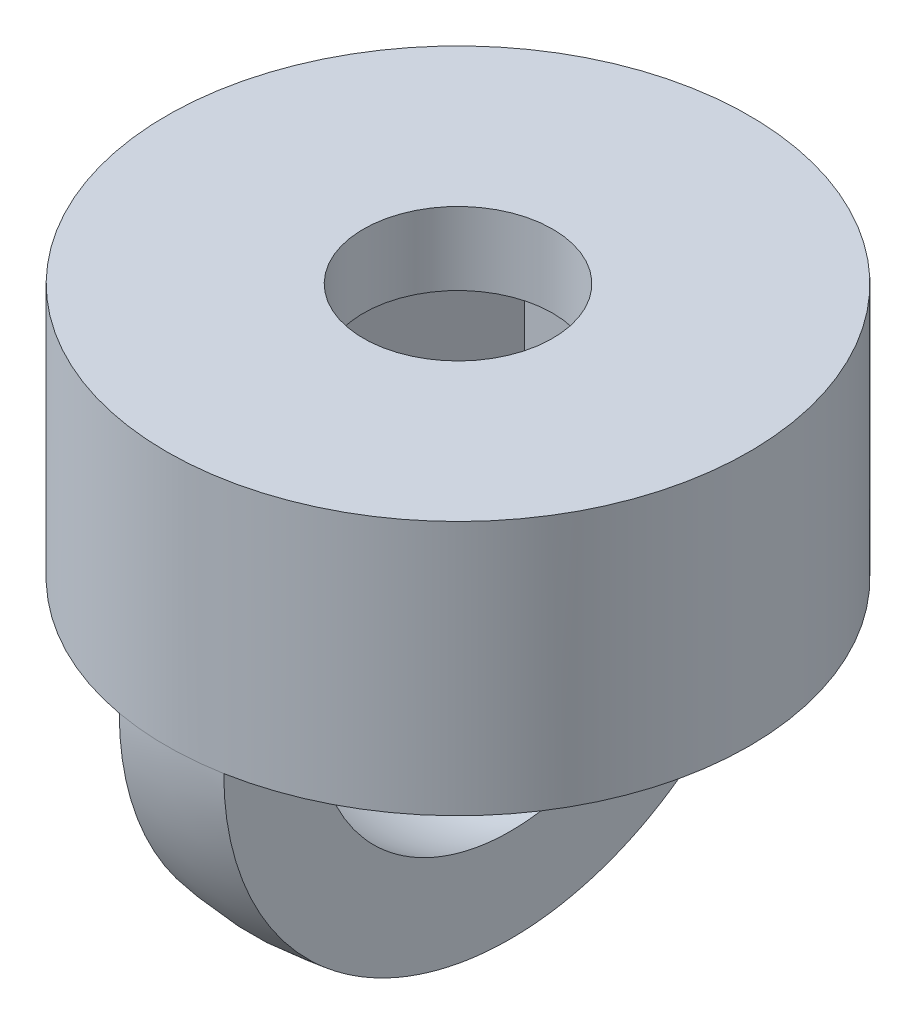
ISO-10303-21;
HEADER;
FILE_DESCRIPTION(('STEP AP214'),'2;1');
FILE_NAME('part.step','',(''),(''),'','','');
FILE_SCHEMA(('AUTOMOTIVE_DESIGN { 1 0 10303 214 1 1 1 1 }'));
ENDSEC;
DATA;
#1=APPLICATION_CONTEXT('core data for automotive mechanical design processes');
#2=APPLICATION_PROTOCOL_DEFINITION('international standard','automotive_design',2000,#1);
#3=PRODUCT_CONTEXT('',#1,'mechanical');
#4=PRODUCT('Part','Part','',(#3));
#5=PRODUCT_RELATED_PRODUCT_CATEGORY('part','',(#4));
#6=PRODUCT_DEFINITION_FORMATION('','',#4);
#7=PRODUCT_DEFINITION_CONTEXT('part definition',#1,'design');
#8=PRODUCT_DEFINITION('design','',#6,#7);
#9=PRODUCT_DEFINITION_SHAPE('','',#8);
#10=(LENGTH_UNIT() NAMED_UNIT(*) SI_UNIT(.MILLI.,.METRE.));
#11=(NAMED_UNIT(*) PLANE_ANGLE_UNIT() SI_UNIT($,.RADIAN.));
#12=(NAMED_UNIT(*) SI_UNIT($,.STERADIAN.) SOLID_ANGLE_UNIT());
#13=UNCERTAINTY_MEASURE_WITH_UNIT(LENGTH_MEASURE(1.E-05),#10,'distance_accuracy_value','');
#14=(GEOMETRIC_REPRESENTATION_CONTEXT(3) GLOBAL_UNCERTAINTY_ASSIGNED_CONTEXT((#13)) GLOBAL_UNIT_ASSIGNED_CONTEXT((#10,
#11,#12)) REPRESENTATION_CONTEXT('',''));
#15=CARTESIAN_POINT('',(0.,0.,0.));
#16=DIRECTION('',(0.,0.,1.));
#17=DIRECTION('',(1.,0.,0.));
#18=AXIS2_PLACEMENT_3D('',#15,#16,#17);
#19=CARTESIAN_POINT('',(0.,0.,0.));
#20=DIRECTION('',(0.,1.,0.));
#21=DIRECTION('',(-1.,0.,0.));
#22=AXIS2_PLACEMENT_3D('',#19,#20,#21);
#23=SPHERICAL_SURFACE('',#22,5.5);
#24=CARTESIAN_POINT('',(-1.43520407206952,0.,0.));
#25=DIRECTION('',(-1.,0.,0.));
#26=DIRECTION('',(0.,0.,1.));
#27=AXIS2_PLACEMENT_3D('',#24,#25,#26);
#28=CIRCLE('',#27,5.30944340505811);
#29=CARTESIAN_POINT('',(-1.43520407206952,0.,5.30944340505811));
#30=VERTEX_POINT('',#29);
#31=CARTESIAN_POINT('',(-1.43520407206952,0.,-5.30944340505811));
#32=VERTEX_POINT('',#31);
#33=EDGE_CURVE('E137',#30,#32,#28,.F.);
#34=ORIENTED_EDGE('',*,*,#33,.F.);
#35=CARTESIAN_POINT('',(0.,0.,0.));
#36=DIRECTION('',(0.,1.,0.));
#37=DIRECTION('',(0.,0.,1.));
#38=AXIS2_PLACEMENT_3D('',#35,#36,#37);
#39=CIRCLE('',#38,5.5);
#40=CARTESIAN_POINT('',(1.43520407206952,0.,5.30944340505811));
#41=VERTEX_POINT('',#40);
#42=EDGE_CURVE('E135',#30,#41,#39,.T.);
#43=ORIENTED_EDGE('',*,*,#42,.T.);
#44=CARTESIAN_POINT('',(1.43520407206952,0.,0.));
#45=DIRECTION('',(-1.,0.,0.));
#46=DIRECTION('',(0.,0.,1.));
#47=AXIS2_PLACEMENT_3D('',#44,#45,#46);
#48=CIRCLE('',#47,5.30944340505811);
#49=CARTESIAN_POINT('',(1.43520407206952,0.,-5.30944340505811));
#50=VERTEX_POINT('',#49);
#51=EDGE_CURVE('E124',#41,#50,#48,.F.);
#52=ORIENTED_EDGE('',*,*,#51,.T.);
#53=EDGE_CURVE('E134',#50,#32,#39,.T.);
#54=ORIENTED_EDGE('',*,*,#53,.T.);
#55=EDGE_LOOP('',(#34,#43,#52,#54));
#56=FACE_BOUND('',#55,.T.);
#57=ADVANCED_FACE('F43',(#56),#23,.F.);
#58=CARTESIAN_POINT('',(0.,0.,0.));
#59=DIRECTION('',(0.,1.,0.));
#60=DIRECTION('',(-1.,0.,0.));
#61=AXIS2_PLACEMENT_3D('',#58,#59,#60);
#62=SPHERICAL_SURFACE('',#61,8.);
#63=CARTESIAN_POINT('',(0.,0.,0.));
#64=DIRECTION('',(0.,1.,0.));
#65=DIRECTION('',(0.,0.,1.));
#66=AXIS2_PLACEMENT_3D('',#63,#64,#65);
#67=CIRCLE('',#66,8.);
#68=CARTESIAN_POINT('',(-1.43520407206952,0.,7.87020897254419));
#69=VERTEX_POINT('',#68);
#70=CARTESIAN_POINT('',(1.43520407206952,0.,7.87020897254419));
#71=VERTEX_POINT('',#70);
#72=EDGE_CURVE('E225',#69,#71,#67,.T.);
#73=ORIENTED_EDGE('',*,*,#72,.F.);
#74=CARTESIAN_POINT('',(-1.43520407206952,0.,0.));
#75=DIRECTION('',(-1.,0.,0.));
#76=DIRECTION('',(0.,0.,1.));
#77=AXIS2_PLACEMENT_3D('',#74,#75,#76);
#78=CIRCLE('',#77,7.87020897254419);
#79=CARTESIAN_POINT('',(-1.43520407206952,0.,-7.87020897254419));
#80=VERTEX_POINT('',#79);
#81=EDGE_CURVE('E11',#69,#80,#78,.F.);
#82=ORIENTED_EDGE('',*,*,#81,.T.);
#83=CARTESIAN_POINT('',(1.43520407206952,0.,-7.87020897254419));
#84=VERTEX_POINT('',#83);
#85=EDGE_CURVE('E224',#84,#80,#67,.T.);
#86=ORIENTED_EDGE('',*,*,#85,.F.);
#87=CARTESIAN_POINT('',(1.43520407206952,0.,0.));
#88=DIRECTION('',(-1.,0.,0.));
#89=DIRECTION('',(0.,0.,1.));
#90=AXIS2_PLACEMENT_3D('',#87,#88,#89);
#91=CIRCLE('',#90,7.87020897254419);
#92=EDGE_CURVE('E52',#71,#84,#91,.F.);
#93=ORIENTED_EDGE('',*,*,#92,.F.);
#94=EDGE_LOOP('',(#73,#82,#86,#93));
#95=FACE_BOUND('',#94,.T.);
#96=ADVANCED_FACE('F244',(#95),#62,.T.);
#97=CARTESIAN_POINT('',(0.,0.,0.));
#98=DIRECTION('',(0.,1.,0.));
#99=DIRECTION('',(0.,0.,1.));
#100=AXIS2_PLACEMENT_3D('',#97,#98,#99);
#101=PLANE('',#100);
#102=DIRECTION('',(0.5,0.,0.866025403784439));
#103=VECTOR('',#102,1.);
#104=CARTESIAN_POINT('',(3.75,0.,-2.1650635094611));
#105=LINE('',#104,#103);
#106=CARTESIAN_POINT('',(2.5,0.,-4.33012701892219));
#107=VERTEX_POINT('',#106);
#108=CARTESIAN_POINT('',(5.,0.,0.));
#109=VERTEX_POINT('',#108);
#110=EDGE_CURVE('E183',#107,#109,#105,.T.);
#111=ORIENTED_EDGE('',*,*,#110,.F.);
#112=DIRECTION('',(1.,0.,0.));
#113=VECTOR('',#112,1.);
#114=CARTESIAN_POINT('',(0.,0.,-4.33012701892219));
#115=LINE('',#114,#113);
#116=CARTESIAN_POINT('',(-2.5,0.,-4.33012701892219));
#117=VERTEX_POINT('',#116);
#118=EDGE_CURVE('E186',#117,#107,#115,.T.);
#119=ORIENTED_EDGE('',*,*,#118,.F.);
#120=DIRECTION('',(-0.5,0.,0.866025403784439));
#121=VECTOR('',#120,1.);
#122=CARTESIAN_POINT('',(-3.75,0.,-2.1650635094611));
#123=LINE('',#122,#121);
#124=CARTESIAN_POINT('',(-5.,0.,0.));
#125=VERTEX_POINT('',#124);
#126=EDGE_CURVE('E167',#117,#125,#123,.T.);
#127=ORIENTED_EDGE('',*,*,#126,.T.);
#128=DIRECTION('',(0.5,0.,0.866025403784439));
#129=VECTOR('',#128,1.);
#130=CARTESIAN_POINT('',(-3.75,0.,2.1650635094611));
#131=LINE('',#130,#129);
#132=CARTESIAN_POINT('',(-2.5,0.,4.33012701892219));
#133=VERTEX_POINT('',#132);
#134=EDGE_CURVE('E172',#125,#133,#131,.T.);
#135=ORIENTED_EDGE('',*,*,#134,.T.);
#136=DIRECTION('',(1.,0.,0.));
#137=VECTOR('',#136,1.);
#138=CARTESIAN_POINT('',(0.,0.,4.33012701892219));
#139=LINE('',#138,#137);
#140=CARTESIAN_POINT('',(2.5,0.,4.33012701892219));
#141=VERTEX_POINT('',#140);
#142=EDGE_CURVE('E176',#133,#141,#139,.T.);
#143=ORIENTED_EDGE('',*,*,#142,.T.);
#144=DIRECTION('',(-0.5,0.,0.866025403784439));
#145=VECTOR('',#144,1.);
#146=CARTESIAN_POINT('',(3.75,0.,2.1650635094611));
#147=LINE('',#146,#145);
#148=EDGE_CURVE('E179',#109,#141,#147,.T.);
#149=ORIENTED_EDGE('',*,*,#148,.F.);
#150=EDGE_LOOP('',(#111,#119,#127,#135,#143,#149));
#151=FACE_BOUND('',#150,.T.);
#152=DIRECTION('',(0.,0.,1.));
#153=VECTOR('',#152,1.);
#154=CARTESIAN_POINT('',(-1.43520407206952,0.,0.));
#155=LINE('',#154,#153);
#156=EDGE_CURVE('E59',#80,#32,#155,.T.);
#157=ORIENTED_EDGE('',*,*,#156,.T.);
#158=ORIENTED_EDGE('',*,*,#53,.F.);
#159=DIRECTION('',(0.,0.,1.));
#160=VECTOR('',#159,1.);
#161=CARTESIAN_POINT('',(1.43520407206952,0.,0.));
#162=LINE('',#161,#160);
#163=EDGE_CURVE('E121',#84,#50,#162,.T.);
#164=ORIENTED_EDGE('',*,*,#163,.F.);
#165=EDGE_CURVE('E217',#71,#84,#67,.T.);
#166=ORIENTED_EDGE('',*,*,#165,.F.);
#167=EDGE_CURVE('E66',#41,#71,#162,.T.);
#168=ORIENTED_EDGE('',*,*,#167,.F.);
#169=ORIENTED_EDGE('',*,*,#42,.F.);
#170=EDGE_CURVE('E129',#30,#69,#155,.T.);
#171=ORIENTED_EDGE('',*,*,#170,.T.);
#172=EDGE_CURVE('E235',#80,#69,#67,.T.);
#173=ORIENTED_EDGE('',*,*,#172,.F.);
#174=EDGE_LOOP('',(#157,#158,#164,#166,#168,#169,#171,#173));
#175=FACE_BOUND('',#174,.T.);
#176=ADVANCED_FACE('F139',(#151,#175),#101,.F.);
#177=CARTESIAN_POINT('',(0.,5.,-4.33012701892219));
#178=DIRECTION('',(0.,0.,-1.));
#179=DIRECTION('',(-1.,0.,0.));
#180=AXIS2_PLACEMENT_3D('',#177,#178,#179);
#181=PLANE('',#180);
#182=ORIENTED_EDGE('',*,*,#118,.T.);
#183=DIRECTION('',(0.,-1.,0.));
#184=VECTOR('',#183,1.);
#185=CARTESIAN_POINT('',(2.5,5.,-4.33012701892219));
#186=LINE('',#185,#184);
#187=CARTESIAN_POINT('',(2.5,5.,-4.33012701892219));
#188=VERTEX_POINT('',#187);
#189=EDGE_CURVE('E144',#188,#107,#186,.T.);
#190=ORIENTED_EDGE('',*,*,#189,.F.);
#191=DIRECTION('',(1.,0.,0.));
#192=VECTOR('',#191,1.);
#193=CARTESIAN_POINT('',(0.,5.,-4.33012701892219));
#194=LINE('',#193,#192);
#195=CARTESIAN_POINT('',(-2.5,5.,-4.33012701892219));
#196=VERTEX_POINT('',#195);
#197=EDGE_CURVE('E171',#196,#188,#194,.T.);
#198=ORIENTED_EDGE('',*,*,#197,.F.);
#199=DIRECTION('',(0.,-1.,0.));
#200=VECTOR('',#199,1.);
#201=CARTESIAN_POINT('',(-2.5,5.,-4.33012701892219));
#202=LINE('',#201,#200);
#203=EDGE_CURVE('E163',#196,#117,#202,.T.);
#204=ORIENTED_EDGE('',*,*,#203,.T.);
#205=EDGE_LOOP('',(#182,#190,#198,#204));
#206=FACE_BOUND('',#205,.T.);
#207=ADVANCED_FACE('F45',(#206),#181,.F.);
#208=CARTESIAN_POINT('',(3.75,5.,-2.1650635094611));
#209=DIRECTION('',(0.866025403784439,0.,-0.5));
#210=DIRECTION('',(-0.5,0.,-0.866025403784439));
#211=AXIS2_PLACEMENT_3D('',#208,#209,#210);
#212=PLANE('',#211);
#213=ORIENTED_EDGE('',*,*,#110,.T.);
#214=DIRECTION('',(0.,-1.,0.));
#215=VECTOR('',#214,1.);
#216=CARTESIAN_POINT('',(5.,5.,0.));
#217=LINE('',#216,#215);
#218=CARTESIAN_POINT('',(5.,5.,0.));
#219=VERTEX_POINT('',#218);
#220=EDGE_CURVE('E149',#219,#109,#217,.T.);
#221=ORIENTED_EDGE('',*,*,#220,.F.);
#222=DIRECTION('',(0.5,0.,0.866025403784439));
#223=VECTOR('',#222,1.);
#224=CARTESIAN_POINT('',(3.75,5.,-2.1650635094611));
#225=LINE('',#224,#223);
#226=EDGE_CURVE('E204',#188,#219,#225,.T.);
#227=ORIENTED_EDGE('',*,*,#226,.F.);
#228=ORIENTED_EDGE('',*,*,#189,.T.);
#229=EDGE_LOOP('',(#213,#221,#227,#228));
#230=FACE_BOUND('',#229,.T.);
#231=ADVANCED_FACE('F291',(#230),#212,.F.);
#232=CARTESIAN_POINT('',(3.75,5.,2.1650635094611));
#233=DIRECTION('',(0.866025403784439,0.,0.5));
#234=DIRECTION('',(0.5,0.,-0.866025403784439));
#235=AXIS2_PLACEMENT_3D('',#232,#233,#234);
#236=PLANE('',#235);
#237=ORIENTED_EDGE('',*,*,#148,.T.);
#238=DIRECTION('',(0.,-1.,0.));
#239=VECTOR('',#238,1.);
#240=CARTESIAN_POINT('',(2.5,5.,4.33012701892219));
#241=LINE('',#240,#239);
#242=CARTESIAN_POINT('',(2.5,5.,4.33012701892219));
#243=VERTEX_POINT('',#242);
#244=EDGE_CURVE('E153',#243,#141,#241,.T.);
#245=ORIENTED_EDGE('',*,*,#244,.F.);
#246=DIRECTION('',(-0.5,0.,0.866025403784439));
#247=VECTOR('',#246,1.);
#248=CARTESIAN_POINT('',(3.75,5.,2.1650635094611));
#249=LINE('',#248,#247);
#250=EDGE_CURVE('E201',#219,#243,#249,.T.);
#251=ORIENTED_EDGE('',*,*,#250,.F.);
#252=ORIENTED_EDGE('',*,*,#220,.T.);
#253=EDGE_LOOP('',(#237,#245,#251,#252));
#254=FACE_BOUND('',#253,.T.);
#255=ADVANCED_FACE('F288',(#254),#236,.F.);
#256=CARTESIAN_POINT('',(0.,5.,4.33012701892219));
#257=DIRECTION('',(0.,0.,-1.));
#258=DIRECTION('',(-1.,0.,0.));
#259=AXIS2_PLACEMENT_3D('',#256,#257,#258);
#260=PLANE('',#259);
#261=ORIENTED_EDGE('',*,*,#142,.F.);
#262=DIRECTION('',(0.,-1.,0.));
#263=VECTOR('',#262,1.);
#264=CARTESIAN_POINT('',(-2.5,5.,4.33012701892219));
#265=LINE('',#264,#263);
#266=CARTESIAN_POINT('',(-2.5,5.,4.33012701892219));
#267=VERTEX_POINT('',#266);
#268=EDGE_CURVE('E157',#267,#133,#265,.T.);
#269=ORIENTED_EDGE('',*,*,#268,.F.);
#270=DIRECTION('',(1.,0.,0.));
#271=VECTOR('',#270,1.);
#272=CARTESIAN_POINT('',(0.,5.,4.33012701892219));
#273=LINE('',#272,#271);
#274=EDGE_CURVE('E197',#267,#243,#273,.T.);
#275=ORIENTED_EDGE('',*,*,#274,.T.);
#276=ORIENTED_EDGE('',*,*,#244,.T.);
#277=EDGE_LOOP('',(#261,#269,#275,#276));
#278=FACE_BOUND('',#277,.T.);
#279=ADVANCED_FACE('F284',(#278),#260,.T.);
#280=CARTESIAN_POINT('',(-3.75,5.,2.1650635094611));
#281=DIRECTION('',(0.866025403784439,0.,-0.5));
#282=DIRECTION('',(-0.5,0.,-0.866025403784439));
#283=AXIS2_PLACEMENT_3D('',#280,#281,#282);
#284=PLANE('',#283);
#285=ORIENTED_EDGE('',*,*,#134,.F.);
#286=DIRECTION('',(0.,-1.,0.));
#287=VECTOR('',#286,1.);
#288=CARTESIAN_POINT('',(-5.,5.,0.));
#289=LINE('',#288,#287);
#290=CARTESIAN_POINT('',(-5.,5.,0.));
#291=VERTEX_POINT('',#290);
#292=EDGE_CURVE('E160',#291,#125,#289,.T.);
#293=ORIENTED_EDGE('',*,*,#292,.F.);
#294=DIRECTION('',(0.5,0.,0.866025403784439));
#295=VECTOR('',#294,1.);
#296=CARTESIAN_POINT('',(-3.75,5.,2.1650635094611));
#297=LINE('',#296,#295);
#298=EDGE_CURVE('E193',#291,#267,#297,.T.);
#299=ORIENTED_EDGE('',*,*,#298,.T.);
#300=ORIENTED_EDGE('',*,*,#268,.T.);
#301=EDGE_LOOP('',(#285,#293,#299,#300));
#302=FACE_BOUND('',#301,.T.);
#303=ADVANCED_FACE('F280',(#302),#284,.T.);
#304=CARTESIAN_POINT('',(-3.75,5.,-2.1650635094611));
#305=DIRECTION('',(0.866025403784439,0.,0.5));
#306=DIRECTION('',(0.5,0.,-0.866025403784439));
#307=AXIS2_PLACEMENT_3D('',#304,#305,#306);
#308=PLANE('',#307);
#309=ORIENTED_EDGE('',*,*,#126,.F.);
#310=ORIENTED_EDGE('',*,*,#203,.F.);
#311=DIRECTION('',(-0.5,0.,0.866025403784439));
#312=VECTOR('',#311,1.);
#313=CARTESIAN_POINT('',(-3.75,5.,-2.1650635094611));
#314=LINE('',#313,#312);
#315=EDGE_CURVE('E166',#196,#291,#314,.T.);
#316=ORIENTED_EDGE('',*,*,#315,.T.);
#317=ORIENTED_EDGE('',*,*,#292,.T.);
#318=EDGE_LOOP('',(#309,#310,#316,#317));
#319=FACE_BOUND('',#318,.T.);
#320=ADVANCED_FACE('F277',(#319),#308,.T.);
#321=CARTESIAN_POINT('',(0.,5.,0.));
#322=DIRECTION('',(0.,-1.,0.));
#323=DIRECTION('',(0.,0.,-1.));
#324=AXIS2_PLACEMENT_3D('',#321,#322,#323);
#325=CYLINDRICAL_SURFACE('',#324,8.);
#326=ORIENTED_EDGE('',*,*,#165,.T.);
#327=ORIENTED_EDGE('',*,*,#85,.T.);
#328=ORIENTED_EDGE('',*,*,#172,.T.);
#329=ORIENTED_EDGE('',*,*,#72,.T.);
#330=EDGE_LOOP('',(#326,#327,#328,#329));
#331=FACE_BOUND('',#330,.T.);
#332=CARTESIAN_POINT('',(0.,7.,0.));
#333=DIRECTION('',(0.,1.,0.));
#334=DIRECTION('',(0.,0.,1.));
#335=AXIS2_PLACEMENT_3D('',#332,#333,#334);
#336=CIRCLE('',#335,8.);
#337=CARTESIAN_POINT('',(0.,7.,8.));
#338=VERTEX_POINT('',#337);
#339=EDGE_CURVE('E189',#338,#338,#336,.T.);
#340=ORIENTED_EDGE('',*,*,#339,.F.);
#341=EDGE_LOOP('',(#340));
#342=FACE_BOUND('',#341,.T.);
#343=ADVANCED_FACE('F240',(#331,#342),#325,.T.);
#344=CARTESIAN_POINT('',(0.,5.,0.));
#345=DIRECTION('',(0.,1.,0.));
#346=DIRECTION('',(0.,0.,1.));
#347=AXIS2_PLACEMENT_3D('',#344,#345,#346);
#348=PLANE('',#347);
#349=CARTESIAN_POINT('',(0.,5.,0.));
#350=DIRECTION('',(0.,-1.,0.));
#351=DIRECTION('',(0.,0.,-1.));
#352=AXIS2_PLACEMENT_3D('',#349,#350,#351);
#353=CIRCLE('',#352,2.6);
#354=CARTESIAN_POINT('',(0.,5.,-2.6));
#355=VERTEX_POINT('',#354);
#356=EDGE_CURVE('E213',#355,#355,#353,.T.);
#357=ORIENTED_EDGE('',*,*,#356,.F.);
#358=EDGE_LOOP('',(#357));
#359=FACE_BOUND('',#358,.T.);
#360=ORIENTED_EDGE('',*,*,#315,.F.);
#361=ORIENTED_EDGE('',*,*,#197,.T.);
#362=ORIENTED_EDGE('',*,*,#226,.T.);
#363=ORIENTED_EDGE('',*,*,#250,.T.);
#364=ORIENTED_EDGE('',*,*,#274,.F.);
#365=ORIENTED_EDGE('',*,*,#298,.F.);
#366=EDGE_LOOP('',(#360,#361,#362,#363,#364,#365));
#367=FACE_BOUND('',#366,.T.);
#368=ADVANCED_FACE('F267',(#359,#367),#348,.F.);
#369=CARTESIAN_POINT('',(0.,7.,0.));
#370=DIRECTION('',(0.,1.,0.));
#371=DIRECTION('',(0.,0.,1.));
#372=AXIS2_PLACEMENT_3D('',#369,#370,#371);
#373=PLANE('',#372);
#374=CARTESIAN_POINT('',(0.,7.,0.));
#375=DIRECTION('',(0.,-1.,0.));
#376=DIRECTION('',(0.,0.,-1.));
#377=AXIS2_PLACEMENT_3D('',#374,#375,#376);
#378=CIRCLE('',#377,2.6);
#379=CARTESIAN_POINT('',(0.,7.,-2.6));
#380=VERTEX_POINT('',#379);
#381=EDGE_CURVE('E212',#380,#380,#378,.T.);
#382=ORIENTED_EDGE('',*,*,#381,.T.);
#383=EDGE_LOOP('',(#382));
#384=FACE_BOUND('',#383,.T.);
#385=ORIENTED_EDGE('',*,*,#339,.T.);
#386=EDGE_LOOP('',(#385));
#387=FACE_BOUND('',#386,.T.);
#388=ADVANCED_FACE('F263',(#384,#387),#373,.T.);
#389=CARTESIAN_POINT('',(0.,7.,0.));
#390=DIRECTION('',(0.,-1.,0.));
#391=DIRECTION('',(0.,0.,-1.));
#392=AXIS2_PLACEMENT_3D('',#389,#390,#391);
#393=CYLINDRICAL_SURFACE('',#392,2.6);
#394=ORIENTED_EDGE('',*,*,#381,.F.);
#395=EDGE_LOOP('',(#394));
#396=FACE_BOUND('',#395,.T.);
#397=ORIENTED_EDGE('',*,*,#356,.T.);
#398=EDGE_LOOP('',(#397));
#399=FACE_BOUND('',#398,.T.);
#400=ADVANCED_FACE('F252',(#396,#399),#393,.F.);
#401=CARTESIAN_POINT('',(1.43520407206952,-8.,0.));
#402=DIRECTION('',(-1.,0.,0.));
#403=DIRECTION('',(0.,0.,1.));
#404=AXIS2_PLACEMENT_3D('',#401,#402,#403);
#405=PLANE('',#404);
#406=ORIENTED_EDGE('',*,*,#167,.T.);
#407=ORIENTED_EDGE('',*,*,#92,.T.);
#408=ORIENTED_EDGE('',*,*,#163,.T.);
#409=ORIENTED_EDGE('',*,*,#51,.F.);
#410=EDGE_LOOP('',(#406,#407,#408,#409));
#411=FACE_BOUND('',#410,.T.);
#412=ADVANCED_FACE('F123',(#411),#405,.F.);
#413=CARTESIAN_POINT('',(-1.43520407206952,-8.,0.));
#414=DIRECTION('',(-1.,0.,0.));
#415=DIRECTION('',(0.,0.,1.));
#416=AXIS2_PLACEMENT_3D('',#413,#414,#415);
#417=PLANE('',#416);
#418=ORIENTED_EDGE('',*,*,#33,.T.);
#419=ORIENTED_EDGE('',*,*,#156,.F.);
#420=ORIENTED_EDGE('',*,*,#81,.F.);
#421=ORIENTED_EDGE('',*,*,#170,.F.);
#422=EDGE_LOOP('',(#418,#419,#420,#421));
#423=FACE_BOUND('',#422,.T.);
#424=ADVANCED_FACE('F246',(#423),#417,.T.);
#425=CLOSED_SHELL('',(#57,#96,#176,#207,#231,#255,#279,#303,#320,#343,#368,#388,#400,#412,#424));
#426=MANIFOLD_SOLID_BREP('B2',#425);
#427=ADVANCED_BREP_SHAPE_REPRESENTATION('',(#18,#426),#14);
#428=SHAPE_DEFINITION_REPRESENTATION(#9,#427);
ENDSEC;
END-ISO-10303-21;
